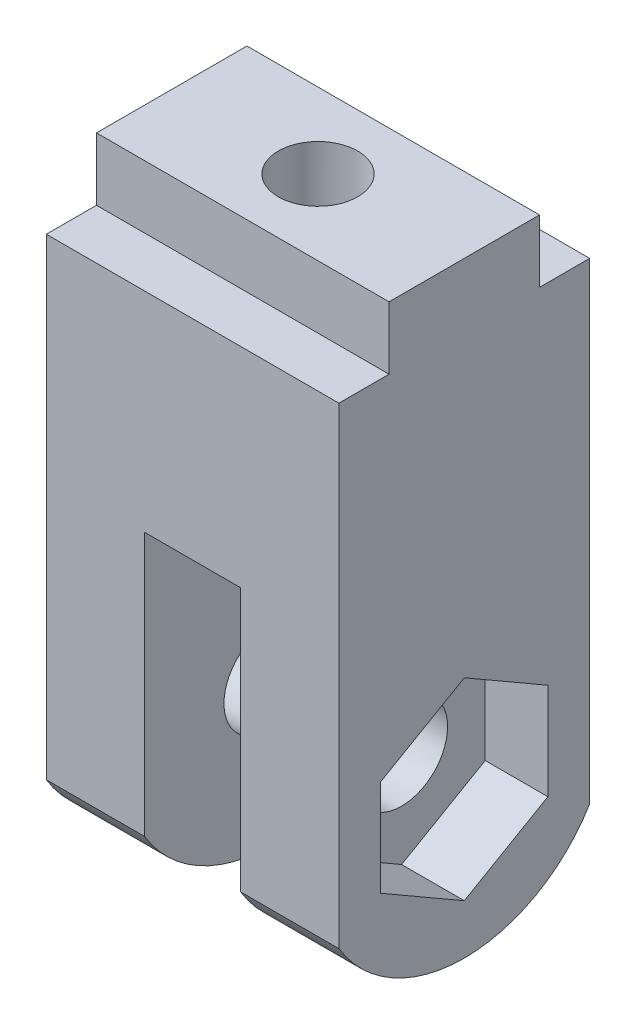
ISO-10303-21;
HEADER;
FILE_DESCRIPTION(('STEP AP214'),'2;1');
FILE_NAME('part.step','',(''),(''),'','','');
FILE_SCHEMA(('AUTOMOTIVE_DESIGN { 1 0 10303 214 1 1 1 1 }'));
ENDSEC;
DATA;
#1=APPLICATION_CONTEXT('core data for automotive mechanical design processes');
#2=APPLICATION_PROTOCOL_DEFINITION('international standard','automotive_design',2000,#1);
#3=PRODUCT_CONTEXT('',#1,'mechanical');
#4=PRODUCT('Part','Part','',(#3));
#5=PRODUCT_RELATED_PRODUCT_CATEGORY('part','',(#4));
#6=PRODUCT_DEFINITION_FORMATION('','',#4);
#7=PRODUCT_DEFINITION_CONTEXT('part definition',#1,'design');
#8=PRODUCT_DEFINITION('design','',#6,#7);
#9=PRODUCT_DEFINITION_SHAPE('','',#8);
#10=(LENGTH_UNIT() NAMED_UNIT(*) SI_UNIT(.MILLI.,.METRE.));
#11=(NAMED_UNIT(*) PLANE_ANGLE_UNIT() SI_UNIT($,.RADIAN.));
#12=(NAMED_UNIT(*) SI_UNIT($,.STERADIAN.) SOLID_ANGLE_UNIT());
#13=UNCERTAINTY_MEASURE_WITH_UNIT(LENGTH_MEASURE(1.E-05),#10,'distance_accuracy_value','');
#14=(GEOMETRIC_REPRESENTATION_CONTEXT(3) GLOBAL_UNCERTAINTY_ASSIGNED_CONTEXT((#13)) GLOBAL_UNIT_ASSIGNED_CONTEXT((#10,
#11,#12)) REPRESENTATION_CONTEXT('',''));
#15=CARTESIAN_POINT('',(0.,0.,0.));
#16=DIRECTION('',(0.,0.,1.));
#17=DIRECTION('',(1.,0.,0.));
#18=AXIS2_PLACEMENT_3D('',#15,#16,#17);
#19=CARTESIAN_POINT('',(3.5,26.,-20.7648230602334));
#20=DIRECTION('',(0.,1.,0.));
#21=DIRECTION('',(0.,0.,1.));
#22=AXIS2_PLACEMENT_3D('',#19,#20,#21);
#23=PLANE('',#22);
#24=DIRECTION('',(1.,0.,0.));
#25=VECTOR('',#24,1.);
#26=CARTESIAN_POINT('',(-3.5,26.,-1.2));
#27=LINE('',#26,#25);
#28=CARTESIAN_POINT('',(-3.5,26.,-1.2));
#29=VERTEX_POINT('',#28);
#30=CARTESIAN_POINT('',(3.5,26.,-1.2));
#31=VERTEX_POINT('',#30);
#32=EDGE_CURVE('E179',#29,#31,#27,.T.);
#33=ORIENTED_EDGE('',*,*,#32,.F.);
#34=DIRECTION('',(0.,0.,1.));
#35=VECTOR('',#34,1.);
#36=CARTESIAN_POINT('',(-3.5,26.,-20.7648230602334));
#37=LINE('',#36,#35);
#38=CARTESIAN_POINT('',(-3.5,26.,0.));
#39=VERTEX_POINT('',#38);
#40=EDGE_CURVE('E309',#29,#39,#37,.T.);
#41=ORIENTED_EDGE('',*,*,#40,.T.);
#42=DIRECTION('',(-1.,0.,0.));
#43=VECTOR('',#42,1.);
#44=CARTESIAN_POINT('',(3.5,26.,0.));
#45=LINE('',#44,#43);
#46=CARTESIAN_POINT('',(3.5,26.,0.));
#47=VERTEX_POINT('',#46);
#48=EDGE_CURVE('E296',#47,#39,#45,.T.);
#49=ORIENTED_EDGE('',*,*,#48,.F.);
#50=DIRECTION('',(0.,0.,1.));
#51=VECTOR('',#50,1.);
#52=CARTESIAN_POINT('',(3.5,26.,-20.7648230602334));
#53=LINE('',#52,#51);
#54=EDGE_CURVE('E49',#31,#47,#53,.T.);
#55=ORIENTED_EDGE('',*,*,#54,.F.);
#56=EDGE_LOOP('',(#33,#41,#49,#55));
#57=FACE_BOUND('',#56,.T.);
#58=ADVANCED_FACE('F32',(#57),#23,.T.);
#59=CARTESIAN_POINT('',(-3.5,16.5,-3.));
#60=DIRECTION('',(1.,0.,0.));
#61=DIRECTION('',(0.,1.,0.));
#62=AXIS2_PLACEMENT_3D('',#59,#60,#61);
#63=CYLINDRICAL_SURFACE('',#62,1.1);
#64=CARTESIAN_POINT('',(1.15,16.5,-3.));
#65=DIRECTION('',(-1.,0.,0.));
#66=DIRECTION('',(0.,-1.,0.));
#67=AXIS2_PLACEMENT_3D('',#64,#65,#66);
#68=CIRCLE('',#67,1.1);
#69=CARTESIAN_POINT('',(1.15,15.4,-3.));
#70=VERTEX_POINT('',#69);
#71=EDGE_CURVE('E269',#70,#70,#68,.T.);
#72=ORIENTED_EDGE('',*,*,#71,.T.);
#73=EDGE_LOOP('',(#72));
#74=FACE_BOUND('',#73,.T.);
#75=CARTESIAN_POINT('',(2.,16.5,-3.));
#76=DIRECTION('',(1.,0.,0.));
#77=DIRECTION('',(0.,0.,-1.));
#78=AXIS2_PLACEMENT_3D('',#75,#76,#77);
#79=CIRCLE('',#78,1.1);
#80=CARTESIAN_POINT('',(2.,16.5,-4.1));
#81=VERTEX_POINT('',#80);
#82=EDGE_CURVE('E239',#81,#81,#79,.F.);
#83=ORIENTED_EDGE('',*,*,#82,.F.);
#84=EDGE_LOOP('',(#83));
#85=FACE_BOUND('',#84,.T.);
#86=ADVANCED_FACE('F384',(#74,#85),#63,.F.);
#87=CARTESIAN_POINT('',(-3.5,26.,-20.7648230602334));
#88=DIRECTION('',(-1.,0.,0.));
#89=DIRECTION('',(0.,-1.,0.));
#90=AXIS2_PLACEMENT_3D('',#87,#88,#89);
#91=PLANE('',#90);
#92=CARTESIAN_POINT('',(-3.5,16.5,-3.));
#93=DIRECTION('',(1.,0.,0.));
#94=DIRECTION('',(0.,1.,0.));
#95=AXIS2_PLACEMENT_3D('',#92,#93,#94);
#96=CIRCLE('',#95,1.1);
#97=CARTESIAN_POINT('',(-3.5,17.6,-3.));
#98=VERTEX_POINT('',#97);
#99=EDGE_CURVE('E265',#98,#98,#96,.T.);
#100=ORIENTED_EDGE('',*,*,#99,.T.);
#101=EDGE_LOOP('',(#100));
#102=FACE_BOUND('',#101,.T.);
#103=DIRECTION('',(0.,1.,0.));
#104=VECTOR('',#103,1.);
#105=CARTESIAN_POINT('',(-3.5,26.,-6.));
#106=LINE('',#105,#104);
#107=CARTESIAN_POINT('',(-3.5,14.697224362268,-6.));
#108=VERTEX_POINT('',#107);
#109=CARTESIAN_POINT('',(-3.5,26.,-6.));
#110=VERTEX_POINT('',#109);
#111=EDGE_CURVE('E283',#108,#110,#106,.T.);
#112=ORIENTED_EDGE('',*,*,#111,.F.);
#113=CARTESIAN_POINT('',(-3.5,16.5,-3.));
#114=DIRECTION('',(1.,0.,0.));
#115=DIRECTION('',(0.,1.,0.));
#116=AXIS2_PLACEMENT_3D('',#113,#114,#115);
#117=CIRCLE('',#116,3.5);
#118=CARTESIAN_POINT('',(-3.5,14.697224362268,0.));
#119=VERTEX_POINT('',#118);
#120=EDGE_CURVE('E254',#119,#108,#117,.T.);
#121=ORIENTED_EDGE('',*,*,#120,.F.);
#122=DIRECTION('',(0.,-1.,0.));
#123=VECTOR('',#122,1.);
#124=CARTESIAN_POINT('',(-3.5,26.,0.));
#125=LINE('',#124,#123);
#126=EDGE_CURVE('E299',#39,#119,#125,.T.);
#127=ORIENTED_EDGE('',*,*,#126,.F.);
#128=ORIENTED_EDGE('',*,*,#40,.F.);
#129=DIRECTION('',(0.,-1.,0.));
#130=VECTOR('',#129,1.);
#131=CARTESIAN_POINT('',(-3.5,27.5,-1.2));
#132=LINE('',#131,#130);
#133=CARTESIAN_POINT('',(-3.5,27.5,-1.2));
#134=VERTEX_POINT('',#133);
#135=EDGE_CURVE('E188',#134,#29,#132,.T.);
#136=ORIENTED_EDGE('',*,*,#135,.F.);
#137=DIRECTION('',(0.,0.,1.));
#138=VECTOR('',#137,1.);
#139=CARTESIAN_POINT('',(-3.5,27.5,-1.2));
#140=LINE('',#139,#138);
#141=CARTESIAN_POINT('',(-3.5,27.5,-4.8));
#142=VERTEX_POINT('',#141);
#143=EDGE_CURVE('E169',#142,#134,#140,.T.);
#144=ORIENTED_EDGE('',*,*,#143,.F.);
#145=DIRECTION('',(0.,-1.,0.));
#146=VECTOR('',#145,1.);
#147=CARTESIAN_POINT('',(-3.5,27.5,-4.8));
#148=LINE('',#147,#146);
#149=CARTESIAN_POINT('',(-3.5,26.,-4.8));
#150=VERTEX_POINT('',#149);
#151=EDGE_CURVE('E166',#142,#150,#148,.T.);
#152=ORIENTED_EDGE('',*,*,#151,.T.);
#153=EDGE_CURVE('E276',#110,#150,#37,.T.);
#154=ORIENTED_EDGE('',*,*,#153,.F.);
#155=EDGE_LOOP('',(#112,#121,#127,#128,#136,#144,#152,#154));
#156=FACE_BOUND('',#155,.T.);
#157=ADVANCED_FACE('F348',(#102,#156),#91,.T.);
#158=CARTESIAN_POINT('',(3.5,13.,-20.7648230602334));
#159=DIRECTION('',(1.,0.,0.));
#160=DIRECTION('',(0.,1.,0.));
#161=AXIS2_PLACEMENT_3D('',#158,#159,#160);
#162=PLANE('',#161);
#163=DIRECTION('',(0.,0.499999999999998,0.86602540378444));
#164=VECTOR('',#163,1.);
#165=CARTESIAN_POINT('',(3.5,17.6547005383792,-5.));
#166=LINE('',#165,#164);
#167=CARTESIAN_POINT('',(3.5,17.6547005383792,-5.));
#168=VERTEX_POINT('',#167);
#169=CARTESIAN_POINT('',(3.5,18.8094010767585,-2.99999999999999));
#170=VERTEX_POINT('',#169);
#171=EDGE_CURVE('E184',#168,#170,#166,.T.);
#172=ORIENTED_EDGE('',*,*,#171,.F.);
#173=DIRECTION('',(0.,1.,0.));
#174=VECTOR('',#173,1.);
#175=CARTESIAN_POINT('',(3.5,15.3452994616207,-5.));
#176=LINE('',#175,#174);
#177=CARTESIAN_POINT('',(3.5,15.3452994616207,-5.));
#178=VERTEX_POINT('',#177);
#179=EDGE_CURVE('E208',#178,#168,#176,.T.);
#180=ORIENTED_EDGE('',*,*,#179,.F.);
#181=DIRECTION('',(0.,0.5,-0.866025403784439));
#182=VECTOR('',#181,1.);
#183=CARTESIAN_POINT('',(3.5,14.1905989232415,-3.));
#184=LINE('',#183,#182);
#185=CARTESIAN_POINT('',(3.5,14.1905989232415,-3.));
#186=VERTEX_POINT('',#185);
#187=EDGE_CURVE('E232',#186,#178,#184,.T.);
#188=ORIENTED_EDGE('',*,*,#187,.F.);
#189=DIRECTION('',(0.,-0.499999999999999,-0.866025403784439));
#190=VECTOR('',#189,1.);
#191=CARTESIAN_POINT('',(3.5,15.3452994616207,-0.999999999999997));
#192=LINE('',#191,#190);
#193=CARTESIAN_POINT('',(3.5,15.3452994616207,-0.999999999999997));
#194=VERTEX_POINT('',#193);
#195=EDGE_CURVE('E229',#194,#186,#192,.T.);
#196=ORIENTED_EDGE('',*,*,#195,.F.);
#197=DIRECTION('',(0.,-1.,0.));
#198=VECTOR('',#197,1.);
#199=CARTESIAN_POINT('',(3.5,17.6547005383792,-0.999999999999997));
#200=LINE('',#199,#198);
#201=CARTESIAN_POINT('',(3.5,17.6547005383792,-0.999999999999997));
#202=VERTEX_POINT('',#201);
#203=EDGE_CURVE('E226',#202,#194,#200,.T.);
#204=ORIENTED_EDGE('',*,*,#203,.F.);
#205=DIRECTION('',(0.,-0.499999999999999,0.866025403784439));
#206=VECTOR('',#205,1.);
#207=CARTESIAN_POINT('',(3.5,18.8094010767585,-2.99999999999999));
#208=LINE('',#207,#206);
#209=EDGE_CURVE('E186',#170,#202,#208,.T.);
#210=ORIENTED_EDGE('',*,*,#209,.F.);
#211=EDGE_LOOP('',(#172,#180,#188,#196,#204,#210));
#212=FACE_BOUND('',#211,.T.);
#213=CARTESIAN_POINT('',(3.5,16.5,-3.));
#214=DIRECTION('',(1.,0.,0.));
#215=DIRECTION('',(0.,1.,0.));
#216=AXIS2_PLACEMENT_3D('',#213,#214,#215);
#217=CIRCLE('',#216,3.5);
#218=CARTESIAN_POINT('',(3.5,14.697224362268,0.));
#219=VERTEX_POINT('',#218);
#220=CARTESIAN_POINT('',(3.5,14.697224362268,-6.));
#221=VERTEX_POINT('',#220);
#222=EDGE_CURVE('E253',#219,#221,#217,.T.);
#223=ORIENTED_EDGE('',*,*,#222,.T.);
#224=DIRECTION('',(0.,-1.,0.));
#225=VECTOR('',#224,1.);
#226=CARTESIAN_POINT('',(3.5,13.,-6.));
#227=LINE('',#226,#225);
#228=CARTESIAN_POINT('',(3.5,26.,-6.));
#229=VERTEX_POINT('',#228);
#230=EDGE_CURVE('E278',#229,#221,#227,.T.);
#231=ORIENTED_EDGE('',*,*,#230,.F.);
#232=CARTESIAN_POINT('',(3.5,26.,-4.8));
#233=VERTEX_POINT('',#232);
#234=EDGE_CURVE('E183',#229,#233,#53,.T.);
#235=ORIENTED_EDGE('',*,*,#234,.T.);
#236=DIRECTION('',(0.,-1.,0.));
#237=VECTOR('',#236,1.);
#238=CARTESIAN_POINT('',(3.5,27.5,-4.8));
#239=LINE('',#238,#237);
#240=CARTESIAN_POINT('',(3.5,27.5,-4.8));
#241=VERTEX_POINT('',#240);
#242=EDGE_CURVE('E164',#241,#233,#239,.T.);
#243=ORIENTED_EDGE('',*,*,#242,.F.);
#244=DIRECTION('',(0.,0.,-1.));
#245=VECTOR('',#244,1.);
#246=CARTESIAN_POINT('',(3.5,27.5,-1.2));
#247=LINE('',#246,#245);
#248=CARTESIAN_POINT('',(3.5,27.5,-1.2));
#249=VERTEX_POINT('',#248);
#250=EDGE_CURVE('E170',#249,#241,#247,.T.);
#251=ORIENTED_EDGE('',*,*,#250,.F.);
#252=DIRECTION('',(0.,-1.,0.));
#253=VECTOR('',#252,1.);
#254=CARTESIAN_POINT('',(3.5,27.5,-1.2));
#255=LINE('',#254,#253);
#256=EDGE_CURVE('E197',#249,#31,#255,.T.);
#257=ORIENTED_EDGE('',*,*,#256,.T.);
#258=ORIENTED_EDGE('',*,*,#54,.T.);
#259=DIRECTION('',(0.,1.,0.));
#260=VECTOR('',#259,1.);
#261=CARTESIAN_POINT('',(3.5,13.,0.));
#262=LINE('',#261,#260);
#263=EDGE_CURVE('E293',#219,#47,#262,.T.);
#264=ORIENTED_EDGE('',*,*,#263,.F.);
#265=EDGE_LOOP('',(#223,#231,#235,#243,#251,#257,#258,#264));
#266=FACE_BOUND('',#265,.T.);
#267=ADVANCED_FACE('F181',(#212,#266),#162,.T.);
#268=CARTESIAN_POINT('',(1.15,21.,-20.7648230602334));
#269=DIRECTION('',(-1.,0.,0.));
#270=DIRECTION('',(0.,-1.,0.));
#271=AXIS2_PLACEMENT_3D('',#268,#269,#270);
#272=PLANE('',#271);
#273=ORIENTED_EDGE('',*,*,#71,.F.);
#274=EDGE_LOOP('',(#273));
#275=FACE_BOUND('',#274,.T.);
#276=DIRECTION('',(0.,1.,0.));
#277=VECTOR('',#276,1.);
#278=CARTESIAN_POINT('',(1.15,21.,-6.));
#279=LINE('',#278,#277);
#280=CARTESIAN_POINT('',(1.15,14.697224362268,-6.));
#281=VERTEX_POINT('',#280);
#282=CARTESIAN_POINT('',(1.15,21.,-6.));
#283=VERTEX_POINT('',#282);
#284=EDGE_CURVE('E275',#281,#283,#279,.T.);
#285=ORIENTED_EDGE('',*,*,#284,.F.);
#286=CARTESIAN_POINT('',(1.15,16.5,-3.));
#287=DIRECTION('',(-1.,0.,0.));
#288=DIRECTION('',(0.,-1.,0.));
#289=AXIS2_PLACEMENT_3D('',#286,#287,#288);
#290=CIRCLE('',#289,3.5);
#291=CARTESIAN_POINT('',(1.15,14.697224362268,0.));
#292=VERTEX_POINT('',#291);
#293=EDGE_CURVE('E262',#281,#292,#290,.T.);
#294=ORIENTED_EDGE('',*,*,#293,.T.);
#295=DIRECTION('',(0.,-1.,0.));
#296=VECTOR('',#295,1.);
#297=CARTESIAN_POINT('',(1.15,21.,0.));
#298=LINE('',#297,#296);
#299=CARTESIAN_POINT('',(1.15,21.,0.));
#300=VERTEX_POINT('',#299);
#301=EDGE_CURVE('E290',#300,#292,#298,.T.);
#302=ORIENTED_EDGE('',*,*,#301,.F.);
#303=DIRECTION('',(0.,0.,1.));
#304=VECTOR('',#303,1.);
#305=CARTESIAN_POINT('',(1.15,21.,-20.7648230602334));
#306=LINE('',#305,#304);
#307=EDGE_CURVE('E322',#283,#300,#306,.T.);
#308=ORIENTED_EDGE('',*,*,#307,.F.);
#309=EDGE_LOOP('',(#285,#294,#302,#308));
#310=FACE_BOUND('',#309,.T.);
#311=ADVANCED_FACE('F371',(#275,#310),#272,.T.);
#312=CARTESIAN_POINT('',(-1.15,13.,-20.7648230602334));
#313=DIRECTION('',(1.,0.,0.));
#314=DIRECTION('',(0.,1.,0.));
#315=AXIS2_PLACEMENT_3D('',#312,#313,#314);
#316=PLANE('',#315);
#317=CARTESIAN_POINT('',(-1.15,16.5,-3.));
#318=DIRECTION('',(1.,0.,0.));
#319=DIRECTION('',(0.,1.,0.));
#320=AXIS2_PLACEMENT_3D('',#317,#318,#319);
#321=CIRCLE('',#320,1.1);
#322=CARTESIAN_POINT('',(-1.15,17.6,-3.));
#323=VERTEX_POINT('',#322);
#324=EDGE_CURVE('E268',#323,#323,#321,.T.);
#325=ORIENTED_EDGE('',*,*,#324,.F.);
#326=EDGE_LOOP('',(#325));
#327=FACE_BOUND('',#326,.T.);
#328=CARTESIAN_POINT('',(-1.15,16.5,-3.));
#329=DIRECTION('',(1.,0.,0.));
#330=DIRECTION('',(0.,1.,0.));
#331=AXIS2_PLACEMENT_3D('',#328,#329,#330);
#332=CIRCLE('',#331,3.5);
#333=CARTESIAN_POINT('',(-1.15,14.697224362268,0.));
#334=VERTEX_POINT('',#333);
#335=CARTESIAN_POINT('',(-1.15,14.697224362268,-6.));
#336=VERTEX_POINT('',#335);
#337=EDGE_CURVE('E260',#334,#336,#332,.T.);
#338=ORIENTED_EDGE('',*,*,#337,.T.);
#339=DIRECTION('',(0.,-1.,0.));
#340=VECTOR('',#339,1.);
#341=CARTESIAN_POINT('',(-1.15,13.,-6.));
#342=LINE('',#341,#340);
#343=CARTESIAN_POINT('',(-1.15,21.,-6.));
#344=VERTEX_POINT('',#343);
#345=EDGE_CURVE('E285',#344,#336,#342,.T.);
#346=ORIENTED_EDGE('',*,*,#345,.F.);
#347=DIRECTION('',(0.,0.,1.));
#348=VECTOR('',#347,1.);
#349=CARTESIAN_POINT('',(-1.15,21.,-20.7648230602334));
#350=LINE('',#349,#348);
#351=CARTESIAN_POINT('',(-1.15,21.,0.));
#352=VERTEX_POINT('',#351);
#353=EDGE_CURVE('E302',#344,#352,#350,.T.);
#354=ORIENTED_EDGE('',*,*,#353,.T.);
#355=DIRECTION('',(0.,1.,0.));
#356=VECTOR('',#355,1.);
#357=CARTESIAN_POINT('',(-1.15,13.,0.));
#358=LINE('',#357,#356);
#359=EDGE_CURVE('E272',#334,#352,#358,.T.);
#360=ORIENTED_EDGE('',*,*,#359,.F.);
#361=EDGE_LOOP('',(#338,#346,#354,#360));
#362=FACE_BOUND('',#361,.T.);
#363=ADVANCED_FACE('F34',(#327,#362),#316,.T.);
#364=CARTESIAN_POINT('',(0.,0.,-6.));
#365=DIRECTION('',(0.,0.,1.));
#366=DIRECTION('',(1.,0.,0.));
#367=AXIS2_PLACEMENT_3D('',#364,#365,#366);
#368=PLANE('',#367);
#369=DIRECTION('',(1.,0.,0.));
#370=VECTOR('',#369,1.);
#371=CARTESIAN_POINT('',(-3.5,14.697224362268,-6.));
#372=LINE('',#371,#370);
#373=EDGE_CURVE('E250',#108,#336,#372,.T.);
#374=ORIENTED_EDGE('',*,*,#373,.F.);
#375=ORIENTED_EDGE('',*,*,#111,.T.);
#376=DIRECTION('',(1.,0.,0.));
#377=VECTOR('',#376,1.);
#378=CARTESIAN_POINT('',(3.5,26.,-6.));
#379=LINE('',#378,#377);
#380=EDGE_CURVE('E281',#110,#229,#379,.T.);
#381=ORIENTED_EDGE('',*,*,#380,.T.);
#382=ORIENTED_EDGE('',*,*,#230,.T.);
#383=DIRECTION('',(1.,0.,0.));
#384=VECTOR('',#383,1.);
#385=CARTESIAN_POINT('',(-3.5,14.697224362268,-6.));
#386=LINE('',#385,#384);
#387=EDGE_CURVE('E11',#281,#221,#386,.T.);
#388=ORIENTED_EDGE('',*,*,#387,.F.);
#389=ORIENTED_EDGE('',*,*,#284,.T.);
#390=DIRECTION('',(-1.,0.,0.));
#391=VECTOR('',#390,1.);
#392=CARTESIAN_POINT('',(-1.15,21.,-6.));
#393=LINE('',#392,#391);
#394=EDGE_CURVE('E273',#283,#344,#393,.T.);
#395=ORIENTED_EDGE('',*,*,#394,.T.);
#396=ORIENTED_EDGE('',*,*,#345,.T.);
#397=EDGE_LOOP('',(#374,#375,#381,#382,#388,#389,#395,#396));
#398=FACE_BOUND('',#397,.T.);
#399=ADVANCED_FACE('F359',(#398),#368,.F.);
#400=CARTESIAN_POINT('',(0.,0.,0.));
#401=DIRECTION('',(0.,0.,1.));
#402=DIRECTION('',(1.,0.,0.));
#403=AXIS2_PLACEMENT_3D('',#400,#401,#402);
#404=PLANE('',#403);
#405=ORIENTED_EDGE('',*,*,#126,.T.);
#406=DIRECTION('',(1.,0.,0.));
#407=VECTOR('',#406,1.);
#408=CARTESIAN_POINT('',(-3.5,14.697224362268,0.));
#409=LINE('',#408,#407);
#410=EDGE_CURVE('E256',#119,#334,#409,.T.);
#411=ORIENTED_EDGE('',*,*,#410,.T.);
#412=ORIENTED_EDGE('',*,*,#359,.T.);
#413=DIRECTION('',(1.,0.,0.));
#414=VECTOR('',#413,1.);
#415=CARTESIAN_POINT('',(-1.15,21.,0.));
#416=LINE('',#415,#414);
#417=EDGE_CURVE('E287',#352,#300,#416,.T.);
#418=ORIENTED_EDGE('',*,*,#417,.T.);
#419=ORIENTED_EDGE('',*,*,#301,.T.);
#420=DIRECTION('',(1.,0.,0.));
#421=VECTOR('',#420,1.);
#422=CARTESIAN_POINT('',(-3.5,14.697224362268,0.));
#423=LINE('',#422,#421);
#424=EDGE_CURVE('E41',#292,#219,#423,.T.);
#425=ORIENTED_EDGE('',*,*,#424,.T.);
#426=ORIENTED_EDGE('',*,*,#263,.T.);
#427=ORIENTED_EDGE('',*,*,#48,.T.);
#428=EDGE_LOOP('',(#405,#411,#412,#418,#419,#425,#426,#427));
#429=FACE_BOUND('',#428,.T.);
#430=ADVANCED_FACE('F352',(#429),#404,.T.);
#431=DIRECTION('',(-1.,0.,0.));
#432=VECTOR('',#431,1.);
#433=CARTESIAN_POINT('',(-3.5,26.,-4.8));
#434=LINE('',#433,#432);
#435=EDGE_CURVE('E57',#233,#150,#434,.T.);
#436=ORIENTED_EDGE('',*,*,#435,.F.);
#437=ORIENTED_EDGE('',*,*,#234,.F.);
#438=ORIENTED_EDGE('',*,*,#380,.F.);
#439=ORIENTED_EDGE('',*,*,#153,.T.);
#440=EDGE_LOOP('',(#436,#437,#438,#439));
#441=FACE_BOUND('',#440,.T.);
#442=ADVANCED_FACE('F362',(#441),#23,.T.);
#443=CARTESIAN_POINT('',(-1.15,21.,-20.7648230602334));
#444=DIRECTION('',(0.,-1.,0.));
#445=DIRECTION('',(0.,0.,-1.));
#446=AXIS2_PLACEMENT_3D('',#443,#444,#445);
#447=PLANE('',#446);
#448=CARTESIAN_POINT('',(0.,21.,-3.));
#449=DIRECTION('',(0.,-1.,0.));
#450=DIRECTION('',(0.,0.,-1.));
#451=AXIS2_PLACEMENT_3D('',#448,#449,#450);
#452=CIRCLE('',#451,0.95);
#453=CARTESIAN_POINT('',(0.,21.,-3.95));
#454=VERTEX_POINT('',#453);
#455=EDGE_CURVE('E331',#454,#454,#452,.F.);
#456=ORIENTED_EDGE('',*,*,#455,.T.);
#457=EDGE_LOOP('',(#456));
#458=FACE_BOUND('',#457,.T.);
#459=ORIENTED_EDGE('',*,*,#394,.F.);
#460=ORIENTED_EDGE('',*,*,#307,.T.);
#461=ORIENTED_EDGE('',*,*,#417,.F.);
#462=ORIENTED_EDGE('',*,*,#353,.F.);
#463=EDGE_LOOP('',(#459,#460,#461,#462));
#464=FACE_BOUND('',#463,.T.);
#465=ADVANCED_FACE('F369',(#458,#464),#447,.T.);
#466=ORIENTED_EDGE('',*,*,#324,.T.);
#467=EDGE_LOOP('',(#466));
#468=FACE_BOUND('',#467,.T.);
#469=ORIENTED_EDGE('',*,*,#99,.F.);
#470=EDGE_LOOP('',(#469));
#471=FACE_BOUND('',#470,.T.);
#472=ADVANCED_FACE('F391',(#468,#471),#63,.F.);
#473=CARTESIAN_POINT('',(-3.5,16.5,-3.));
#474=DIRECTION('',(1.,0.,0.));
#475=DIRECTION('',(0.,1.,0.));
#476=AXIS2_PLACEMENT_3D('',#473,#474,#475);
#477=CYLINDRICAL_SURFACE('',#476,3.5);
#478=ORIENTED_EDGE('',*,*,#293,.F.);
#479=ORIENTED_EDGE('',*,*,#387,.T.);
#480=ORIENTED_EDGE('',*,*,#222,.F.);
#481=ORIENTED_EDGE('',*,*,#424,.F.);
#482=EDGE_LOOP('',(#478,#479,#480,#481));
#483=FACE_BOUND('',#482,.T.);
#484=ADVANCED_FACE('F355',(#483),#477,.T.);
#485=ORIENTED_EDGE('',*,*,#410,.F.);
#486=ORIENTED_EDGE('',*,*,#120,.T.);
#487=ORIENTED_EDGE('',*,*,#373,.T.);
#488=ORIENTED_EDGE('',*,*,#337,.F.);
#489=EDGE_LOOP('',(#485,#486,#487,#488));
#490=FACE_BOUND('',#489,.T.);
#491=ADVANCED_FACE('F364',(#490),#477,.T.);
#492=CARTESIAN_POINT('',(2.,0.,0.));
#493=DIRECTION('',(1.,0.,0.));
#494=DIRECTION('',(0.,0.,-1.));
#495=AXIS2_PLACEMENT_3D('',#492,#493,#494);
#496=PLANE('',#495);
#497=DIRECTION('',(0.,0.499999999999998,0.86602540378444));
#498=VECTOR('',#497,1.);
#499=CARTESIAN_POINT('',(2.,17.6547005383792,-5.));
#500=LINE('',#499,#498);
#501=CARTESIAN_POINT('',(2.,17.6547005383792,-5.));
#502=VERTEX_POINT('',#501);
#503=CARTESIAN_POINT('',(2.,18.8094010767585,-2.99999999999999));
#504=VERTEX_POINT('',#503);
#505=EDGE_CURVE('E204',#502,#504,#500,.T.);
#506=ORIENTED_EDGE('',*,*,#505,.T.);
#507=DIRECTION('',(0.,-0.499999999999999,0.866025403784439));
#508=VECTOR('',#507,1.);
#509=CARTESIAN_POINT('',(2.,18.8094010767585,-2.99999999999999));
#510=LINE('',#509,#508);
#511=CARTESIAN_POINT('',(2.,17.6547005383792,-0.999999999999997));
#512=VERTEX_POINT('',#511);
#513=EDGE_CURVE('E207',#504,#512,#510,.T.);
#514=ORIENTED_EDGE('',*,*,#513,.T.);
#515=DIRECTION('',(0.,-1.,0.));
#516=VECTOR('',#515,1.);
#517=CARTESIAN_POINT('',(2.,17.6547005383792,-0.999999999999997));
#518=LINE('',#517,#516);
#519=CARTESIAN_POINT('',(2.,15.3452994616207,-0.999999999999997));
#520=VERTEX_POINT('',#519);
#521=EDGE_CURVE('E211',#512,#520,#518,.T.);
#522=ORIENTED_EDGE('',*,*,#521,.T.);
#523=DIRECTION('',(0.,-0.499999999999999,-0.866025403784439));
#524=VECTOR('',#523,1.);
#525=CARTESIAN_POINT('',(2.,15.3452994616207,-0.999999999999997));
#526=LINE('',#525,#524);
#527=CARTESIAN_POINT('',(2.,14.1905989232415,-3.));
#528=VERTEX_POINT('',#527);
#529=EDGE_CURVE('E214',#520,#528,#526,.T.);
#530=ORIENTED_EDGE('',*,*,#529,.T.);
#531=DIRECTION('',(0.,0.5,-0.866025403784439));
#532=VECTOR('',#531,1.);
#533=CARTESIAN_POINT('',(2.,14.1905989232415,-3.));
#534=LINE('',#533,#532);
#535=CARTESIAN_POINT('',(2.,15.3452994616207,-5.));
#536=VERTEX_POINT('',#535);
#537=EDGE_CURVE('E217',#528,#536,#534,.T.);
#538=ORIENTED_EDGE('',*,*,#537,.T.);
#539=DIRECTION('',(0.,1.,0.));
#540=VECTOR('',#539,1.);
#541=CARTESIAN_POINT('',(2.,15.3452994616207,-5.));
#542=LINE('',#541,#540);
#543=EDGE_CURVE('E220',#536,#502,#542,.T.);
#544=ORIENTED_EDGE('',*,*,#543,.T.);
#545=EDGE_LOOP('',(#506,#514,#522,#530,#538,#544));
#546=FACE_BOUND('',#545,.T.);
#547=ORIENTED_EDGE('',*,*,#82,.T.);
#548=EDGE_LOOP('',(#547));
#549=FACE_BOUND('',#548,.T.);
#550=ADVANCED_FACE('F417',(#546,#549),#496,.T.);
#551=CARTESIAN_POINT('',(2.,17.6547005383792,-5.));
#552=DIRECTION('',(0.,0.86602540378444,-0.499999999999998));
#553=DIRECTION('',(0.,0.499999999999998,0.86602540378444));
#554=AXIS2_PLACEMENT_3D('',#551,#552,#553);
#555=PLANE('',#554);
#556=ORIENTED_EDGE('',*,*,#171,.T.);
#557=DIRECTION('',(1.,0.,0.));
#558=VECTOR('',#557,1.);
#559=CARTESIAN_POINT('',(2.,18.8094010767585,-2.99999999999999));
#560=LINE('',#559,#558);
#561=EDGE_CURVE('E222',#504,#170,#560,.T.);
#562=ORIENTED_EDGE('',*,*,#561,.F.);
#563=ORIENTED_EDGE('',*,*,#505,.F.);
#564=DIRECTION('',(1.,0.,0.));
#565=VECTOR('',#564,1.);
#566=CARTESIAN_POINT('',(2.,17.6547005383792,-5.));
#567=LINE('',#566,#565);
#568=EDGE_CURVE('E237',#502,#168,#567,.T.);
#569=ORIENTED_EDGE('',*,*,#568,.T.);
#570=EDGE_LOOP('',(#556,#562,#563,#569));
#571=FACE_BOUND('',#570,.T.);
#572=ADVANCED_FACE('F418',(#571),#555,.F.);
#573=CARTESIAN_POINT('',(2.,15.3452994616207,-5.));
#574=DIRECTION('',(0.,0.,-1.));
#575=DIRECTION('',(-1.,0.,0.));
#576=AXIS2_PLACEMENT_3D('',#573,#574,#575);
#577=PLANE('',#576);
#578=ORIENTED_EDGE('',*,*,#179,.T.);
#579=ORIENTED_EDGE('',*,*,#568,.F.);
#580=ORIENTED_EDGE('',*,*,#543,.F.);
#581=DIRECTION('',(1.,0.,0.));
#582=VECTOR('',#581,1.);
#583=CARTESIAN_POINT('',(2.,15.3452994616207,-5.));
#584=LINE('',#583,#582);
#585=EDGE_CURVE('E240',#536,#178,#584,.T.);
#586=ORIENTED_EDGE('',*,*,#585,.T.);
#587=EDGE_LOOP('',(#578,#579,#580,#586));
#588=FACE_BOUND('',#587,.T.);
#589=ADVANCED_FACE('F421',(#588),#577,.F.);
#590=CARTESIAN_POINT('',(2.,14.1905989232415,-3.));
#591=DIRECTION('',(0.,-0.866025403784439,-0.5));
#592=DIRECTION('',(0.,0.5,-0.866025403784439));
#593=AXIS2_PLACEMENT_3D('',#590,#591,#592);
#594=PLANE('',#593);
#595=ORIENTED_EDGE('',*,*,#187,.T.);
#596=ORIENTED_EDGE('',*,*,#585,.F.);
#597=ORIENTED_EDGE('',*,*,#537,.F.);
#598=DIRECTION('',(1.,0.,0.));
#599=VECTOR('',#598,1.);
#600=CARTESIAN_POINT('',(2.,14.1905989232415,-3.));
#601=LINE('',#600,#599);
#602=EDGE_CURVE('E242',#528,#186,#601,.T.);
#603=ORIENTED_EDGE('',*,*,#602,.T.);
#604=EDGE_LOOP('',(#595,#596,#597,#603));
#605=FACE_BOUND('',#604,.T.);
#606=ADVANCED_FACE('F434',(#605),#594,.F.);
#607=CARTESIAN_POINT('',(2.,15.3452994616207,-0.999999999999997));
#608=DIRECTION('',(0.,-0.866025403784439,0.499999999999999));
#609=DIRECTION('',(0.,-0.499999999999999,-0.866025403784439));
#610=AXIS2_PLACEMENT_3D('',#607,#608,#609);
#611=PLANE('',#610);
#612=ORIENTED_EDGE('',*,*,#195,.T.);
#613=ORIENTED_EDGE('',*,*,#602,.F.);
#614=ORIENTED_EDGE('',*,*,#529,.F.);
#615=DIRECTION('',(1.,0.,0.));
#616=VECTOR('',#615,1.);
#617=CARTESIAN_POINT('',(2.,15.3452994616207,-0.999999999999997));
#618=LINE('',#617,#616);
#619=EDGE_CURVE('E244',#520,#194,#618,.T.);
#620=ORIENTED_EDGE('',*,*,#619,.T.);
#621=EDGE_LOOP('',(#612,#613,#614,#620));
#622=FACE_BOUND('',#621,.T.);
#623=ADVANCED_FACE('F430',(#622),#611,.F.);
#624=CARTESIAN_POINT('',(2.,17.6547005383792,-0.999999999999997));
#625=DIRECTION('',(0.,0.,1.));
#626=DIRECTION('',(0.,-1.,0.));
#627=AXIS2_PLACEMENT_3D('',#624,#625,#626);
#628=PLANE('',#627);
#629=ORIENTED_EDGE('',*,*,#203,.T.);
#630=ORIENTED_EDGE('',*,*,#619,.F.);
#631=ORIENTED_EDGE('',*,*,#521,.F.);
#632=DIRECTION('',(1.,0.,0.));
#633=VECTOR('',#632,1.);
#634=CARTESIAN_POINT('',(2.,17.6547005383792,-0.999999999999997));
#635=LINE('',#634,#633);
#636=EDGE_CURVE('E246',#512,#202,#635,.T.);
#637=ORIENTED_EDGE('',*,*,#636,.T.);
#638=EDGE_LOOP('',(#629,#630,#631,#637));
#639=FACE_BOUND('',#638,.T.);
#640=ADVANCED_FACE('F426',(#639),#628,.F.);
#641=CARTESIAN_POINT('',(2.,18.8094010767585,-2.99999999999999));
#642=DIRECTION('',(0.,0.866025403784439,0.499999999999999));
#643=DIRECTION('',(0.,-0.499999999999999,0.866025403784439));
#644=AXIS2_PLACEMENT_3D('',#641,#642,#643);
#645=PLANE('',#644);
#646=ORIENTED_EDGE('',*,*,#209,.T.);
#647=ORIENTED_EDGE('',*,*,#636,.F.);
#648=ORIENTED_EDGE('',*,*,#513,.F.);
#649=ORIENTED_EDGE('',*,*,#561,.T.);
#650=EDGE_LOOP('',(#646,#647,#648,#649));
#651=FACE_BOUND('',#650,.T.);
#652=ADVANCED_FACE('F423',(#651),#645,.F.);
#653=CARTESIAN_POINT('',(-3.5,27.5,-4.8));
#654=DIRECTION('',(0.,0.,1.));
#655=DIRECTION('',(1.,0.,0.));
#656=AXIS2_PLACEMENT_3D('',#653,#654,#655);
#657=PLANE('',#656);
#658=ORIENTED_EDGE('',*,*,#435,.T.);
#659=ORIENTED_EDGE('',*,*,#151,.F.);
#660=DIRECTION('',(-1.,0.,0.));
#661=VECTOR('',#660,1.);
#662=CARTESIAN_POINT('',(-3.5,27.5,-4.8));
#663=LINE('',#662,#661);
#664=EDGE_CURVE('E160',#241,#142,#663,.T.);
#665=ORIENTED_EDGE('',*,*,#664,.F.);
#666=ORIENTED_EDGE('',*,*,#242,.T.);
#667=EDGE_LOOP('',(#658,#659,#665,#666));
#668=FACE_BOUND('',#667,.T.);
#669=ADVANCED_FACE('F162',(#668),#657,.F.);
#670=CARTESIAN_POINT('',(-3.5,27.5,-1.2));
#671=DIRECTION('',(0.,0.,-1.));
#672=DIRECTION('',(-1.,0.,0.));
#673=AXIS2_PLACEMENT_3D('',#670,#671,#672);
#674=PLANE('',#673);
#675=ORIENTED_EDGE('',*,*,#32,.T.);
#676=ORIENTED_EDGE('',*,*,#256,.F.);
#677=DIRECTION('',(1.,0.,0.));
#678=VECTOR('',#677,1.);
#679=CARTESIAN_POINT('',(-3.5,27.5,-1.2));
#680=LINE('',#679,#678);
#681=EDGE_CURVE('E175',#134,#249,#680,.T.);
#682=ORIENTED_EDGE('',*,*,#681,.F.);
#683=ORIENTED_EDGE('',*,*,#135,.T.);
#684=EDGE_LOOP('',(#675,#676,#682,#683));
#685=FACE_BOUND('',#684,.T.);
#686=ADVANCED_FACE('F344',(#685),#674,.F.);
#687=CARTESIAN_POINT('',(0.,27.5,0.));
#688=DIRECTION('',(0.,-1.,0.));
#689=DIRECTION('',(0.,0.,-1.));
#690=AXIS2_PLACEMENT_3D('',#687,#688,#689);
#691=PLANE('',#690);
#692=CARTESIAN_POINT('',(0.,27.5,-3.));
#693=DIRECTION('',(0.,1.,0.));
#694=DIRECTION('',(0.,0.,1.));
#695=AXIS2_PLACEMENT_3D('',#692,#693,#694);
#696=CIRCLE('',#695,0.95);
#697=CARTESIAN_POINT('',(0.,27.5,-2.05));
#698=VERTEX_POINT('',#697);
#699=EDGE_CURVE('E333',#698,#698,#696,.T.);
#700=ORIENTED_EDGE('',*,*,#699,.F.);
#701=EDGE_LOOP('',(#700));
#702=FACE_BOUND('',#701,.T.);
#703=ORIENTED_EDGE('',*,*,#250,.T.);
#704=ORIENTED_EDGE('',*,*,#664,.T.);
#705=ORIENTED_EDGE('',*,*,#143,.T.);
#706=ORIENTED_EDGE('',*,*,#681,.T.);
#707=EDGE_LOOP('',(#703,#704,#705,#706));
#708=FACE_BOUND('',#707,.T.);
#709=ADVANCED_FACE('F173',(#702,#708),#691,.F.);
#710=CARTESIAN_POINT('',(0.,18.3129942314911,-3.));
#711=DIRECTION('',(0.,1.,0.));
#712=DIRECTION('',(0.,0.,1.));
#713=AXIS2_PLACEMENT_3D('',#710,#711,#712);
#714=CYLINDRICAL_SURFACE('',#713,0.95);
#715=ORIENTED_EDGE('',*,*,#699,.T.);
#716=EDGE_LOOP('',(#715));
#717=FACE_BOUND('',#716,.T.);
#718=ORIENTED_EDGE('',*,*,#455,.F.);
#719=EDGE_LOOP('',(#718));
#720=FACE_BOUND('',#719,.T.);
#721=ADVANCED_FACE('F451',(#717,#720),#714,.F.);
#722=CLOSED_SHELL('',(#58,#86,#157,#267,#311,#363,#399,#430,#442,#465,#472,#484,#491,#550,#572,
#589,#606,#623,#640,#652,#669,#686,#709,#721));
#723=MANIFOLD_SOLID_BREP('B2',#722);
#724=ADVANCED_BREP_SHAPE_REPRESENTATION('',(#18,#723),#14);
#725=SHAPE_DEFINITION_REPRESENTATION(#9,#724);
ENDSEC;
END-ISO-10303-21;
